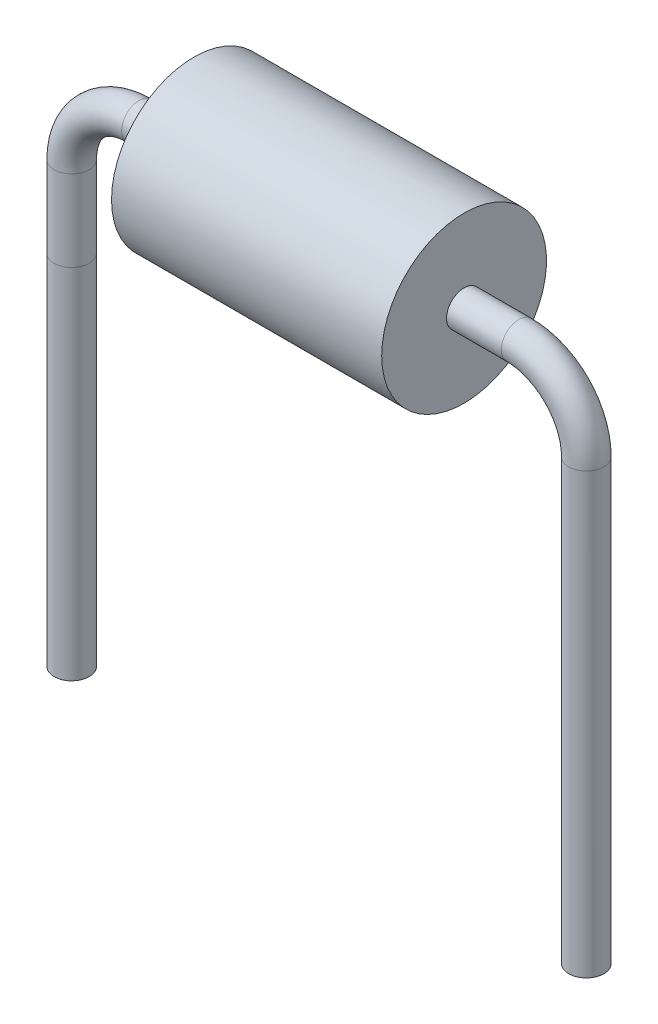
ISO-10303-21;
HEADER;
FILE_DESCRIPTION(('STEP AP214'),'2;1');
FILE_NAME('part.step','',(''),(''),'','','');
FILE_SCHEMA(('AUTOMOTIVE_DESIGN { 1 0 10303 214 1 1 1 1 }'));
ENDSEC;
DATA;
#1=APPLICATION_CONTEXT('core data for automotive mechanical design processes');
#2=APPLICATION_PROTOCOL_DEFINITION('international standard','automotive_design',2000,#1);
#3=PRODUCT_CONTEXT('',#1,'mechanical');
#4=PRODUCT('Part','Part','',(#3));
#5=PRODUCT_RELATED_PRODUCT_CATEGORY('part','',(#4));
#6=PRODUCT_DEFINITION_FORMATION('','',#4);
#7=PRODUCT_DEFINITION_CONTEXT('part definition',#1,'design');
#8=PRODUCT_DEFINITION('design','',#6,#7);
#9=PRODUCT_DEFINITION_SHAPE('','',#8);
#10=(LENGTH_UNIT() NAMED_UNIT(*) SI_UNIT(.MILLI.,.METRE.));
#11=(NAMED_UNIT(*) PLANE_ANGLE_UNIT() SI_UNIT($,.RADIAN.));
#12=(NAMED_UNIT(*) SI_UNIT($,.STERADIAN.) SOLID_ANGLE_UNIT());
#13=UNCERTAINTY_MEASURE_WITH_UNIT(LENGTH_MEASURE(1.E-05),#10,'distance_accuracy_value','');
#14=(GEOMETRIC_REPRESENTATION_CONTEXT(3) GLOBAL_UNCERTAINTY_ASSIGNED_CONTEXT((#13)) GLOBAL_UNIT_ASSIGNED_CONTEXT((#10,
#11,#12)) REPRESENTATION_CONTEXT('',''));
#15=CARTESIAN_POINT('',(0.,0.,0.));
#16=DIRECTION('',(0.,0.,1.));
#17=DIRECTION('',(1.,0.,0.));
#18=AXIS2_PLACEMENT_3D('',#15,#16,#17);
#19=CARTESIAN_POINT('',(-3.81,0.,0.));
#20=DIRECTION('',(0.,1.,0.));
#21=DIRECTION('',(0.,0.,1.));
#22=AXIS2_PLACEMENT_3D('',#19,#20,#21);
#23=PLANE('',#22);
#24=CARTESIAN_POINT('',(-3.81,0.,0.));
#25=DIRECTION('',(0.,-1.,0.));
#26=DIRECTION('',(0.,0.,-1.));
#27=AXIS2_PLACEMENT_3D('',#24,#25,#26);
#28=CIRCLE('',#27,0.26);
#29=CARTESIAN_POINT('',(-3.81,0.,-0.259999999999999));
#30=VERTEX_POINT('',#29);
#31=EDGE_CURVE('P0_E17',#30,#30,#28,.F.);
#32=ORIENTED_EDGE('',*,*,#31,.F.);
#33=EDGE_LOOP('',(#32));
#34=FACE_BOUND('',#33,.T.);
#35=ADVANCED_FACE('P0_F14',(#34),#23,.F.);
#36=CARTESIAN_POINT('',(-3.81,5.3,0.));
#37=DIRECTION('',(0.,1.,0.));
#38=DIRECTION('',(0.,0.,1.));
#39=AXIS2_PLACEMENT_3D('',#36,#37,#38);
#40=PLANE('',#39);
#41=CARTESIAN_POINT('',(-3.81,5.3,0.));
#42=DIRECTION('',(0.,-1.,0.));
#43=DIRECTION('',(0.,0.,-1.));
#44=AXIS2_PLACEMENT_3D('',#41,#42,#43);
#45=CIRCLE('',#44,0.26);
#46=CARTESIAN_POINT('',(-3.81,5.3,-0.259999999999999));
#47=VERTEX_POINT('',#46);
#48=EDGE_CURVE('P0_E9',#47,#47,#45,.T.);
#49=ORIENTED_EDGE('',*,*,#48,.F.);
#50=EDGE_LOOP('',(#49));
#51=FACE_BOUND('',#50,.T.);
#52=ADVANCED_FACE('P0_F29',(#51),#40,.T.);
#53=CARTESIAN_POINT('',(-3.81,5.3,0.));
#54=DIRECTION('',(0.,-1.,0.));
#55=DIRECTION('',(0.,0.,-1.));
#56=AXIS2_PLACEMENT_3D('',#53,#54,#55);
#57=CYLINDRICAL_SURFACE('',#56,0.26);
#58=ORIENTED_EDGE('',*,*,#48,.T.);
#59=EDGE_LOOP('',(#58));
#60=FACE_BOUND('',#59,.T.);
#61=ORIENTED_EDGE('',*,*,#31,.T.);
#62=EDGE_LOOP('',(#61));
#63=FACE_BOUND('',#62,.T.);
#64=ADVANCED_FACE('P0_F26',(#60,#63),#57,.T.);
#65=CLOSED_SHELL('',(#35,#52,#64));
#66=MANIFOLD_SOLID_BREP('P0_B1',#65);
#67=CARTESIAN_POINT('',(3.81,0.,0.));
#68=DIRECTION('',(0.,-1.,0.));
#69=DIRECTION('',(0.,0.,-1.));
#70=AXIS2_PLACEMENT_3D('',#67,#68,#69);
#71=PLANE('',#70);
#72=CARTESIAN_POINT('',(3.81,0.,0.));
#73=DIRECTION('',(0.,-1.,0.));
#74=DIRECTION('',(0.,0.,-1.));
#75=AXIS2_PLACEMENT_3D('',#72,#73,#74);
#76=CIRCLE('',#75,0.26);
#77=CARTESIAN_POINT('',(3.81,0.,-0.259999999999999));
#78=VERTEX_POINT('',#77);
#79=EDGE_CURVE('P1_E19',#78,#78,#76,.F.);
#80=ORIENTED_EDGE('',*,*,#79,.F.);
#81=EDGE_LOOP('',(#80));
#82=FACE_BOUND('',#81,.T.);
#83=ADVANCED_FACE('P1_F15',(#82),#71,.T.);
#84=CARTESIAN_POINT('',(-3.81,5.3,0.));
#85=DIRECTION('',(0.,1.,0.));
#86=DIRECTION('',(0.,0.,1.));
#87=AXIS2_PLACEMENT_3D('',#84,#85,#86);
#88=PLANE('',#87);
#89=CARTESIAN_POINT('',(-3.81,5.3,0.));
#90=DIRECTION('',(0.,-1.,0.));
#91=DIRECTION('',(1.,0.,0.));
#92=AXIS2_PLACEMENT_3D('',#89,#90,#91);
#93=CIRCLE('',#92,0.26);
#94=CARTESIAN_POINT('',(-3.55,5.3,0.));
#95=VERTEX_POINT('',#94);
#96=EDGE_CURVE('P1_E39',#95,#95,#93,.F.);
#97=ORIENTED_EDGE('',*,*,#96,.F.);
#98=EDGE_LOOP('',(#97));
#99=FACE_BOUND('',#98,.T.);
#100=ADVANCED_FACE('P1_F53',(#99),#88,.F.);
#101=CARTESIAN_POINT('',(3.81,5.3,0.));
#102=DIRECTION('',(0.,-1.,0.));
#103=DIRECTION('',(0.,0.,-1.));
#104=AXIS2_PLACEMENT_3D('',#101,#102,#103);
#105=CYLINDRICAL_SURFACE('',#104,0.26);
#106=ORIENTED_EDGE('',*,*,#79,.T.);
#107=EDGE_LOOP('',(#106));
#108=FACE_BOUND('',#107,.T.);
#109=CARTESIAN_POINT('',(3.81,6.5,0.));
#110=DIRECTION('',(0.,1.,0.));
#111=DIRECTION('',(0.,0.,1.));
#112=AXIS2_PLACEMENT_3D('',#109,#110,#111);
#113=CIRCLE('',#112,0.26);
#114=CARTESIAN_POINT('',(3.81,6.5,0.260000000000001));
#115=VERTEX_POINT('',#114);
#116=EDGE_CURVE('P1_E41',#115,#115,#113,.T.);
#117=ORIENTED_EDGE('',*,*,#116,.F.);
#118=EDGE_LOOP('',(#117));
#119=FACE_BOUND('',#118,.T.);
#120=ADVANCED_FACE('P1_F49',(#108,#119),#105,.T.);
#121=CARTESIAN_POINT('',(-3.81,6.5,0.));
#122=DIRECTION('',(0.,-1.,0.));
#123=DIRECTION('',(1.,0.,0.));
#124=AXIS2_PLACEMENT_3D('',#121,#122,#123);
#125=CYLINDRICAL_SURFACE('',#124,0.26);
#126=CARTESIAN_POINT('',(-3.81,6.5,0.));
#127=DIRECTION('',(0.,1.,0.));
#128=DIRECTION('',(0.,0.,1.));
#129=AXIS2_PLACEMENT_3D('',#126,#127,#128);
#130=CIRCLE('',#129,0.26);
#131=CARTESIAN_POINT('',(-3.81,6.5,0.260000000000001));
#132=VERTEX_POINT('',#131);
#133=EDGE_CURVE('P1_E45',#132,#132,#130,.T.);
#134=ORIENTED_EDGE('',*,*,#133,.F.);
#135=EDGE_LOOP('',(#134));
#136=FACE_BOUND('',#135,.T.);
#137=ORIENTED_EDGE('',*,*,#96,.T.);
#138=EDGE_LOOP('',(#137));
#139=FACE_BOUND('',#138,.T.);
#140=ADVANCED_FACE('P1_F83',(#136,#139),#125,.T.);
#141=CARTESIAN_POINT('',(2.80999999999999,6.5,0.));
#142=DIRECTION('',(0.,0.,1.));
#143=DIRECTION('',(1.,0.,0.));
#144=AXIS2_PLACEMENT_3D('',#141,#142,#143);
#145=TOROIDAL_SURFACE('',#144,1.00000000000001,0.26);
#146=ORIENTED_EDGE('',*,*,#116,.T.);
#147=EDGE_LOOP('',(#146));
#148=FACE_BOUND('',#147,.T.);
#149=CARTESIAN_POINT('',(2.80999999999999,7.50000000000001,0.));
#150=DIRECTION('',(-1.,0.,0.));
#151=DIRECTION('',(0.,0.,1.));
#152=AXIS2_PLACEMENT_3D('',#149,#150,#151);
#153=CIRCLE('',#152,0.26);
#154=CARTESIAN_POINT('',(2.80999999999999,7.50000000000001,0.260000000000001));
#155=VERTEX_POINT('',#154);
#156=EDGE_CURVE('P1_E191',#155,#155,#153,.T.);
#157=ORIENTED_EDGE('',*,*,#156,.F.);
#158=EDGE_LOOP('',(#157));
#159=FACE_BOUND('',#158,.T.);
#160=ADVANCED_FACE('P1_F86',(#148,#159),#145,.T.);
#161=CARTESIAN_POINT('',(-2.80999999999999,6.5,0.));
#162=DIRECTION('',(0.,0.,-1.));
#163=DIRECTION('',(-1.,0.,0.));
#164=AXIS2_PLACEMENT_3D('',#161,#162,#163);
#165=TOROIDAL_SURFACE('',#164,1.00000000000001,0.26);
#166=ORIENTED_EDGE('',*,*,#133,.T.);
#167=EDGE_LOOP('',(#166));
#168=FACE_BOUND('',#167,.T.);
#169=CARTESIAN_POINT('',(-2.81,7.50000000000001,0.));
#170=DIRECTION('',(1.,0.,0.));
#171=DIRECTION('',(0.,0.,-1.));
#172=AXIS2_PLACEMENT_3D('',#169,#170,#171);
#173=CIRCLE('',#172,0.26);
#174=CARTESIAN_POINT('',(-2.81,7.50000000000001,-0.259999999999999));
#175=VERTEX_POINT('',#174);
#176=EDGE_CURVE('P1_E38',#175,#175,#173,.T.);
#177=ORIENTED_EDGE('',*,*,#176,.F.);
#178=EDGE_LOOP('',(#177));
#179=FACE_BOUND('',#178,.T.);
#180=ADVANCED_FACE('P1_F17',(#168,#179),#165,.T.);
#181=CARTESIAN_POINT('',(2.81,7.50000000000001,0.));
#182=DIRECTION('',(-1.,0.,0.));
#183=DIRECTION('',(0.,0.,1.));
#184=AXIS2_PLACEMENT_3D('',#181,#182,#183);
#185=CYLINDRICAL_SURFACE('',#184,0.26);
#186=ORIENTED_EDGE('',*,*,#156,.T.);
#187=EDGE_LOOP('',(#186));
#188=FACE_BOUND('',#187,.T.);
#189=CARTESIAN_POINT('',(2.,7.50000000000001,0.));
#190=DIRECTION('',(-1.,0.,0.));
#191=DIRECTION('',(0.,0.,1.));
#192=AXIS2_PLACEMENT_3D('',#189,#190,#191);
#193=CIRCLE('',#192,0.26);
#194=CARTESIAN_POINT('',(2.,7.50000000000001,0.260000000000001));
#195=VERTEX_POINT('',#194);
#196=EDGE_CURVE('P1_E36',#195,#195,#193,.T.);
#197=ORIENTED_EDGE('',*,*,#196,.F.);
#198=EDGE_LOOP('',(#197));
#199=FACE_BOUND('',#198,.T.);
#200=ADVANCED_FACE('P1_F78',(#188,#199),#185,.T.);
#201=CARTESIAN_POINT('',(-2.81,7.50000000000001,0.));
#202=DIRECTION('',(1.,0.,0.));
#203=DIRECTION('',(0.,0.,-1.));
#204=AXIS2_PLACEMENT_3D('',#201,#202,#203);
#205=CYLINDRICAL_SURFACE('',#204,0.26);
#206=CARTESIAN_POINT('',(-2.,7.50000000000001,0.));
#207=DIRECTION('',(1.,0.,0.));
#208=DIRECTION('',(0.,0.,-1.));
#209=AXIS2_PLACEMENT_3D('',#206,#207,#208);
#210=CIRCLE('',#209,0.26);
#211=CARTESIAN_POINT('',(-2.,7.50000000000001,-0.259999999999999));
#212=VERTEX_POINT('',#211);
#213=EDGE_CURVE('P1_E28',#212,#212,#210,.F.);
#214=ORIENTED_EDGE('',*,*,#213,.T.);
#215=EDGE_LOOP('',(#214));
#216=FACE_BOUND('',#215,.T.);
#217=ORIENTED_EDGE('',*,*,#176,.T.);
#218=EDGE_LOOP('',(#217));
#219=FACE_BOUND('',#218,.T.);
#220=ADVANCED_FACE('P1_F74',(#216,#219),#205,.T.);
#221=CARTESIAN_POINT('',(2.,7.50000000000001,0.));
#222=DIRECTION('',(1.,0.,0.));
#223=DIRECTION('',(0.,0.,-1.));
#224=AXIS2_PLACEMENT_3D('',#221,#222,#223);
#225=PLANE('',#224);
#226=CARTESIAN_POINT('',(2.,7.50000000000001,0.));
#227=DIRECTION('',(-1.,0.,0.));
#228=DIRECTION('',(0.,0.,1.));
#229=AXIS2_PLACEMENT_3D('',#226,#227,#228);
#230=CIRCLE('',#229,1.22004116866511);
#231=CARTESIAN_POINT('',(2.,7.50000000000001,1.22004116866511));
#232=VERTEX_POINT('',#231);
#233=EDGE_CURVE('P1_E23',#232,#232,#230,.T.);
#234=ORIENTED_EDGE('',*,*,#233,.F.);
#235=EDGE_LOOP('',(#234));
#236=FACE_BOUND('',#235,.T.);
#237=ORIENTED_EDGE('',*,*,#196,.T.);
#238=EDGE_LOOP('',(#237));
#239=FACE_BOUND('',#238,.T.);
#240=ADVANCED_FACE('P1_F67',(#236,#239),#225,.T.);
#241=CARTESIAN_POINT('',(-2.,7.50000000000001,0.));
#242=DIRECTION('',(1.,0.,0.));
#243=DIRECTION('',(0.,0.,-1.));
#244=AXIS2_PLACEMENT_3D('',#241,#242,#243);
#245=PLANE('',#244);
#246=CARTESIAN_POINT('',(-2.,7.50000000000001,0.));
#247=DIRECTION('',(-1.,0.,0.));
#248=DIRECTION('',(0.,0.,1.));
#249=AXIS2_PLACEMENT_3D('',#246,#247,#248);
#250=CIRCLE('',#249,1.22004116866511);
#251=CARTESIAN_POINT('',(-2.,7.50000000000001,1.22004116866511));
#252=VERTEX_POINT('',#251);
#253=EDGE_CURVE('P1_E9',#252,#252,#250,.F.);
#254=ORIENTED_EDGE('',*,*,#253,.F.);
#255=EDGE_LOOP('',(#254));
#256=FACE_BOUND('',#255,.T.);
#257=ORIENTED_EDGE('',*,*,#213,.F.);
#258=EDGE_LOOP('',(#257));
#259=FACE_BOUND('',#258,.T.);
#260=ADVANCED_FACE('P1_F62',(#256,#259),#245,.F.);
#261=CARTESIAN_POINT('',(2.,7.50000000000001,0.));
#262=DIRECTION('',(-1.,0.,0.));
#263=DIRECTION('',(0.,0.,1.));
#264=AXIS2_PLACEMENT_3D('',#261,#262,#263);
#265=CYLINDRICAL_SURFACE('',#264,1.22004116866511);
#266=ORIENTED_EDGE('',*,*,#253,.T.);
#267=EDGE_LOOP('',(#266));
#268=FACE_BOUND('',#267,.T.);
#269=ORIENTED_EDGE('',*,*,#233,.T.);
#270=EDGE_LOOP('',(#269));
#271=FACE_BOUND('',#270,.T.);
#272=ADVANCED_FACE('P1_F60',(#268,#271),#265,.T.);
#273=CLOSED_SHELL('',(#83,#100,#120,#140,#160,#180,#200,#220,#240,#260,#272));
#274=MANIFOLD_SOLID_BREP('P1_B1',#273);
#275=ADVANCED_BREP_SHAPE_REPRESENTATION('',(#18,#66,#274),#14);
#276=SHAPE_DEFINITION_REPRESENTATION(#9,#275);
ENDSEC;
END-ISO-10303-21;
